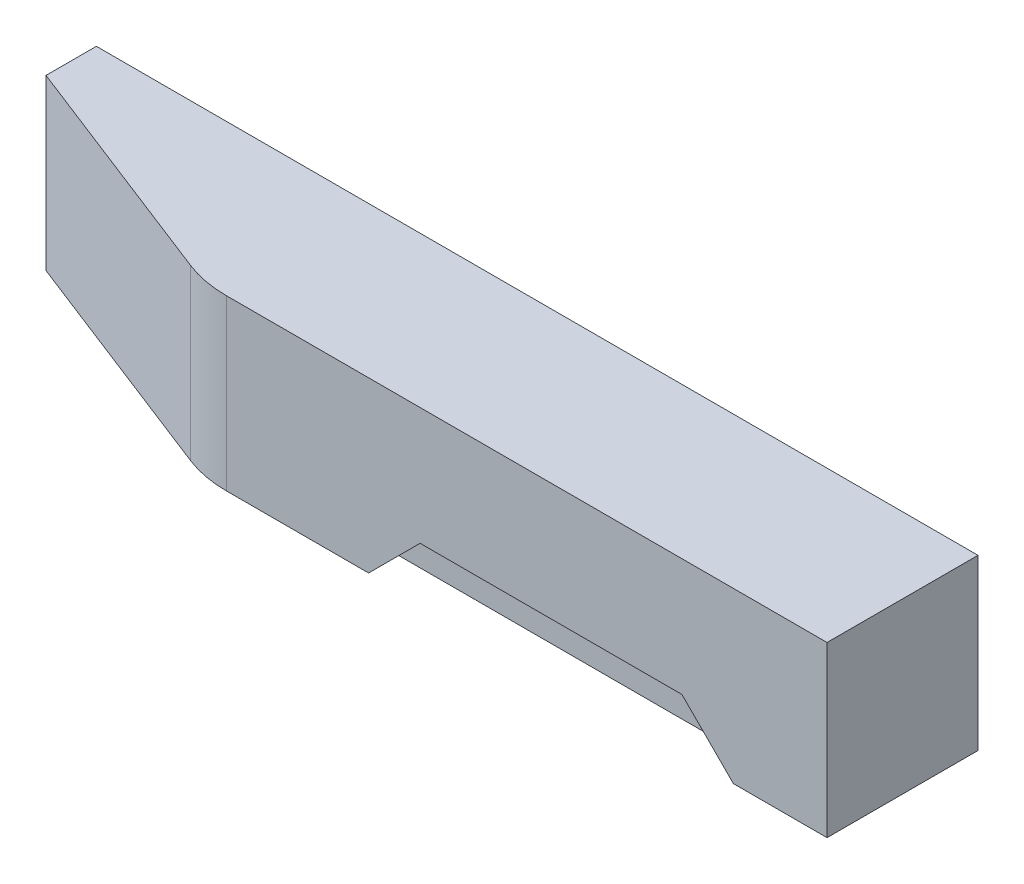
ISO-10303-21;
HEADER;
FILE_DESCRIPTION(('STEP AP214'),'2;1');
FILE_NAME('part.step','',(''),(''),'','','');
FILE_SCHEMA(('AUTOMOTIVE_DESIGN { 1 0 10303 214 1 1 1 1 }'));
ENDSEC;
DATA;
#1=APPLICATION_CONTEXT('core data for automotive mechanical design processes');
#2=APPLICATION_PROTOCOL_DEFINITION('international standard','automotive_design',2000,#1);
#3=PRODUCT_CONTEXT('',#1,'mechanical');
#4=PRODUCT('Part','Part','',(#3));
#5=PRODUCT_RELATED_PRODUCT_CATEGORY('part','',(#4));
#6=PRODUCT_DEFINITION_FORMATION('','',#4);
#7=PRODUCT_DEFINITION_CONTEXT('part definition',#1,'design');
#8=PRODUCT_DEFINITION('design','',#6,#7);
#9=PRODUCT_DEFINITION_SHAPE('','',#8);
#10=(LENGTH_UNIT() NAMED_UNIT(*) SI_UNIT(.MILLI.,.METRE.));
#11=(NAMED_UNIT(*) PLANE_ANGLE_UNIT() SI_UNIT($,.RADIAN.));
#12=(NAMED_UNIT(*) SI_UNIT($,.STERADIAN.) SOLID_ANGLE_UNIT());
#13=UNCERTAINTY_MEASURE_WITH_UNIT(LENGTH_MEASURE(1.E-05),#10,'distance_accuracy_value','');
#14=(GEOMETRIC_REPRESENTATION_CONTEXT(3) GLOBAL_UNCERTAINTY_ASSIGNED_CONTEXT((#13)) GLOBAL_UNIT_ASSIGNED_CONTEXT((#10,
#11,#12)) REPRESENTATION_CONTEXT('',''));
#15=CARTESIAN_POINT('',(0.,0.,0.));
#16=DIRECTION('',(0.,0.,1.));
#17=DIRECTION('',(1.,0.,0.));
#18=AXIS2_PLACEMENT_3D('',#15,#16,#17);
#19=CARTESIAN_POINT('',(-47.836398483139,24.6414389944274,179.620163865149));
#20=DIRECTION('',(0.,-1.,0.));
#21=DIRECTION('',(0.,0.,-1.));
#22=AXIS2_PLACEMENT_3D('',#19,#20,#21);
#23=PLANE('',#22);
#24=DIRECTION('',(0.9317989455985,0.,0.3629748269254));
#25=VECTOR('',#24,1.);
#26=CARTESIAN_POINT('',(-49.196580159362,24.6414389944274,183.111909732108));
#27=LINE('',#26,#25);
#28=CARTESIAN_POINT('',(-62.436398483139,24.6414389944274,177.95444439337));
#29=VERTEX_POINT('',#28);
#30=CARTESIAN_POINT('',(-58.510461474292,24.6414389944274,179.483761756346));
#31=VERTEX_POINT('',#30);
#32=EDGE_CURVE('E145',#29,#31,#27,.T.);
#33=ORIENTED_EDGE('',*,*,#32,.T.);
#34=CARTESIAN_POINT('',(-57.7845118204412,24.6414389944274,177.620163865149));
#35=DIRECTION('',(0.,-1.,0.));
#36=DIRECTION('',(0.,0.,-1.));
#37=AXIS2_PLACEMENT_3D('',#34,#35,#36);
#38=CIRCLE('',#37,2.);
#39=CARTESIAN_POINT('',(-57.7845118204412,24.6414389944274,179.620163865149));
#40=VERTEX_POINT('',#39);
#41=EDGE_CURVE('E177',#31,#40,#38,.F.);
#42=ORIENTED_EDGE('',*,*,#41,.T.);
#43=DIRECTION('',(-1.,0.,0.));
#44=VECTOR('',#43,1.);
#45=CARTESIAN_POINT('',(-47.836398483139,24.6414389944274,179.620163865149));
#46=LINE('',#45,#44);
#47=CARTESIAN_POINT('',(-47.836398483139,24.6414389944274,179.620163865149));
#48=VERTEX_POINT('',#47);
#49=EDGE_CURVE('E149',#48,#40,#46,.T.);
#50=ORIENTED_EDGE('',*,*,#49,.F.);
#51=DIRECTION('',(0.,0.,-1.));
#52=VECTOR('',#51,1.);
#53=CARTESIAN_POINT('',(-47.836398483139,24.6414389944274,179.620163865149));
#54=LINE('',#53,#52);
#55=CARTESIAN_POINT('',(-47.836398483139,24.6414389944274,177.120163865149));
#56=VERTEX_POINT('',#55);
#57=EDGE_CURVE('E156',#48,#56,#54,.T.);
#58=ORIENTED_EDGE('',*,*,#57,.T.);
#59=DIRECTION('',(-1.,0.,0.));
#60=VECTOR('',#59,1.);
#61=CARTESIAN_POINT('',(-47.836398483139,24.6414389944274,177.120163865149));
#62=LINE('',#61,#60);
#63=CARTESIAN_POINT('',(-62.436398483139,24.6414389944274,177.120163865149));
#64=VERTEX_POINT('',#63);
#65=EDGE_CURVE('E148',#56,#64,#62,.T.);
#66=ORIENTED_EDGE('',*,*,#65,.T.);
#67=DIRECTION('',(0.,0.,-1.));
#68=VECTOR('',#67,1.);
#69=CARTESIAN_POINT('',(-62.436398483139,24.6414389944274,179.620163865149));
#70=LINE('',#69,#68);
#71=EDGE_CURVE('E172',#29,#64,#70,.T.);
#72=ORIENTED_EDGE('',*,*,#71,.F.);
#73=EDGE_LOOP('',(#33,#42,#50,#58,#66,#72));
#74=FACE_BOUND('',#73,.T.);
#75=ADVANCED_FACE('F34',(#74),#23,.F.);
#76=CARTESIAN_POINT('',(-62.436398483139,24.6414389944274,179.620163865149));
#77=DIRECTION('',(1.,0.,0.));
#78=DIRECTION('',(0.,0.,-1.));
#79=AXIS2_PLACEMENT_3D('',#76,#77,#78);
#80=PLANE('',#79);
#81=DIRECTION('',(0.,0.,-1.));
#82=VECTOR('',#81,1.);
#83=CARTESIAN_POINT('',(-62.436398483139,21.8414389944274,179.620163865149));
#84=LINE('',#83,#82);
#85=CARTESIAN_POINT('',(-62.436398483139,21.8414389944274,177.95444439337));
#86=VERTEX_POINT('',#85);
#87=CARTESIAN_POINT('',(-62.436398483139,21.8414389944274,177.120163865149));
#88=VERTEX_POINT('',#87);
#89=EDGE_CURVE('E170',#86,#88,#84,.T.);
#90=ORIENTED_EDGE('',*,*,#89,.F.);
#91=DIRECTION('',(0.,-1.,0.));
#92=VECTOR('',#91,1.);
#93=CARTESIAN_POINT('',(-62.436398483139,25.3414389944274,177.95444439337));
#94=LINE('',#93,#92);
#95=EDGE_CURVE('E142',#29,#86,#94,.T.);
#96=ORIENTED_EDGE('',*,*,#95,.F.);
#97=ORIENTED_EDGE('',*,*,#71,.T.);
#98=DIRECTION('',(0.,-1.,0.));
#99=VECTOR('',#98,1.);
#100=CARTESIAN_POINT('',(-62.436398483139,24.6414389944274,177.120163865149));
#101=LINE('',#100,#99);
#102=EDGE_CURVE('E159',#64,#88,#101,.T.);
#103=ORIENTED_EDGE('',*,*,#102,.T.);
#104=EDGE_LOOP('',(#90,#96,#97,#103));
#105=FACE_BOUND('',#104,.T.);
#106=ADVANCED_FACE('F194',(#105),#80,.F.);
#107=CARTESIAN_POINT('',(-62.436398483139,21.8414389944274,179.620163865149));
#108=DIRECTION('',(0.,1.,0.));
#109=DIRECTION('',(0.,0.,1.));
#110=AXIS2_PLACEMENT_3D('',#107,#108,#109);
#111=PLANE('',#110);
#112=DIRECTION('',(1.,0.,0.));
#113=VECTOR('',#112,1.);
#114=CARTESIAN_POINT('',(-49.3870873860383,21.8414389944274,179.120163865149));
#115=LINE('',#114,#113);
#116=CARTESIAN_POINT('',(-55.4283586853574,21.8414389944274,179.120163865149));
#117=VERTEX_POINT('',#116);
#118=CARTESIAN_POINT('',(-49.3870873860383,21.8414389944274,179.120163865149));
#119=VERTEX_POINT('',#118);
#120=EDGE_CURVE('E118',#117,#119,#115,.T.);
#121=ORIENTED_EDGE('',*,*,#120,.F.);
#122=DIRECTION('',(0.,0.,1.));
#123=VECTOR('',#122,1.);
#124=CARTESIAN_POINT('',(-55.4283586853574,21.8414389944274,179.120163865149));
#125=LINE('',#124,#123);
#126=CARTESIAN_POINT('',(-55.4283586853574,21.8414389944274,179.620163865149));
#127=VERTEX_POINT('',#126);
#128=EDGE_CURVE('E143',#117,#127,#125,.T.);
#129=ORIENTED_EDGE('',*,*,#128,.T.);
#130=DIRECTION('',(1.,0.,0.));
#131=VECTOR('',#130,1.);
#132=CARTESIAN_POINT('',(-62.436398483139,21.8414389944274,179.620163865149));
#133=LINE('',#132,#131);
#134=CARTESIAN_POINT('',(-57.7845118204412,21.8414389944274,179.620163865149));
#135=VERTEX_POINT('',#134);
#136=EDGE_CURVE('E152',#135,#127,#133,.T.);
#137=ORIENTED_EDGE('',*,*,#136,.F.);
#138=CARTESIAN_POINT('',(-57.7845118204412,21.8414389944274,177.620163865149));
#139=DIRECTION('',(0.,1.,0.));
#140=DIRECTION('',(0.,0.,1.));
#141=AXIS2_PLACEMENT_3D('',#138,#139,#140);
#142=CIRCLE('',#141,2.);
#143=CARTESIAN_POINT('',(-58.510461474292,21.8414389944274,179.483761756346));
#144=VERTEX_POINT('',#143);
#145=EDGE_CURVE('E11',#135,#144,#142,.F.);
#146=ORIENTED_EDGE('',*,*,#145,.T.);
#147=DIRECTION('',(0.9317989455985,0.,0.3629748269254));
#148=VECTOR('',#147,1.);
#149=CARTESIAN_POINT('',(-62.436398483139,21.8414389944274,177.95444439337));
#150=LINE('',#149,#148);
#151=EDGE_CURVE('E139',#86,#144,#150,.T.);
#152=ORIENTED_EDGE('',*,*,#151,.F.);
#153=ORIENTED_EDGE('',*,*,#89,.T.);
#154=DIRECTION('',(1.,0.,0.));
#155=VECTOR('',#154,1.);
#156=CARTESIAN_POINT('',(-62.436398483139,21.8414389944274,177.120163865149));
#157=LINE('',#156,#155);
#158=CARTESIAN_POINT('',(-47.836398483139,21.8414389944274,177.120163865149));
#159=VERTEX_POINT('',#158);
#160=EDGE_CURVE('E162',#88,#159,#157,.T.);
#161=ORIENTED_EDGE('',*,*,#160,.T.);
#162=DIRECTION('',(0.,0.,-1.));
#163=VECTOR('',#162,1.);
#164=CARTESIAN_POINT('',(-47.836398483139,21.8414389944274,179.620163865149));
#165=LINE('',#164,#163);
#166=CARTESIAN_POINT('',(-47.836398483139,21.8414389944274,179.620163865149));
#167=VERTEX_POINT('',#166);
#168=EDGE_CURVE('E167',#167,#159,#165,.T.);
#169=ORIENTED_EDGE('',*,*,#168,.F.);
#170=CARTESIAN_POINT('',(-49.3870873860384,21.8414389944274,179.620163865149));
#171=VERTEX_POINT('',#170);
#172=EDGE_CURVE('E132',#171,#167,#133,.T.);
#173=ORIENTED_EDGE('',*,*,#172,.F.);
#174=DIRECTION('',(0.,0.,1.));
#175=VECTOR('',#174,1.);
#176=CARTESIAN_POINT('',(-49.3870873860383,21.8414389944274,179.120163865149));
#177=LINE('',#176,#175);
#178=EDGE_CURVE('E49',#119,#171,#177,.T.);
#179=ORIENTED_EDGE('',*,*,#178,.F.);
#180=EDGE_LOOP('',(#121,#129,#137,#146,#152,#153,#161,#169,#173,#179));
#181=FACE_BOUND('',#180,.T.);
#182=ADVANCED_FACE('F130',(#181),#111,.F.);
#183=CARTESIAN_POINT('',(-47.836398483139,21.8414389944274,179.620163865149));
#184=DIRECTION('',(-1.,0.,0.));
#185=DIRECTION('',(0.,0.,1.));
#186=AXIS2_PLACEMENT_3D('',#183,#184,#185);
#187=PLANE('',#186);
#188=DIRECTION('',(0.,1.,0.));
#189=VECTOR('',#188,1.);
#190=CARTESIAN_POINT('',(-47.836398483139,21.8414389944274,177.120163865149));
#191=LINE('',#190,#189);
#192=EDGE_CURVE('E151',#159,#56,#191,.T.);
#193=ORIENTED_EDGE('',*,*,#192,.T.);
#194=ORIENTED_EDGE('',*,*,#57,.F.);
#195=DIRECTION('',(0.,1.,0.));
#196=VECTOR('',#195,1.);
#197=CARTESIAN_POINT('',(-47.836398483139,21.8414389944274,179.620163865149));
#198=LINE('',#197,#196);
#199=EDGE_CURVE('E154',#167,#48,#198,.T.);
#200=ORIENTED_EDGE('',*,*,#199,.F.);
#201=ORIENTED_EDGE('',*,*,#168,.T.);
#202=EDGE_LOOP('',(#193,#194,#200,#201));
#203=FACE_BOUND('',#202,.T.);
#204=ADVANCED_FACE('F202',(#203),#187,.F.);
#205=CARTESIAN_POINT('',(0.,0.,179.620163865149));
#206=DIRECTION('',(0.,0.,1.));
#207=DIRECTION('',(1.,0.,0.));
#208=AXIS2_PLACEMENT_3D('',#205,#206,#207);
#209=PLANE('',#208);
#210=DIRECTION('',(-0.707106781186546,-0.707106781186549,0.));
#211=VECTOR('',#210,1.);
#212=CARTESIAN_POINT('',(-55.4283586853574,21.8414389944274,179.620163865149));
#213=LINE('',#212,#211);
#214=CARTESIAN_POINT('',(-54.5756385717614,22.6941591080234,179.620163865149));
#215=VERTEX_POINT('',#214);
#216=EDGE_CURVE('E127',#215,#127,#213,.T.);
#217=ORIENTED_EDGE('',*,*,#216,.F.);
#218=DIRECTION('',(-1.,0.,0.));
#219=VECTOR('',#218,1.);
#220=CARTESIAN_POINT('',(-54.5756385717614,22.6941591080234,179.620163865149));
#221=LINE('',#220,#219);
#222=CARTESIAN_POINT('',(-50.2398074996343,22.6941591080234,179.620163865149));
#223=VERTEX_POINT('',#222);
#224=EDGE_CURVE('E298',#223,#215,#221,.T.);
#225=ORIENTED_EDGE('',*,*,#224,.F.);
#226=DIRECTION('',(-0.707106781186549,0.707106781186546,0.));
#227=VECTOR('',#226,1.);
#228=CARTESIAN_POINT('',(-50.2398074996343,22.6941591080234,179.620163865149));
#229=LINE('',#228,#227);
#230=EDGE_CURVE('E299',#171,#223,#229,.T.);
#231=ORIENTED_EDGE('',*,*,#230,.F.);
#232=ORIENTED_EDGE('',*,*,#172,.T.);
#233=ORIENTED_EDGE('',*,*,#199,.T.);
#234=ORIENTED_EDGE('',*,*,#49,.T.);
#235=DIRECTION('',(0.,1.,0.));
#236=VECTOR('',#235,1.);
#237=CARTESIAN_POINT('',(-57.7845118204412,21.8414389944274,179.620163865149));
#238=LINE('',#237,#236);
#239=EDGE_CURVE('E42',#40,#135,#238,.F.);
#240=ORIENTED_EDGE('',*,*,#239,.T.);
#241=ORIENTED_EDGE('',*,*,#136,.T.);
#242=EDGE_LOOP('',(#217,#225,#231,#232,#233,#234,#240,#241));
#243=FACE_BOUND('',#242,.T.);
#244=ADVANCED_FACE('F184',(#243),#209,.T.);
#245=CARTESIAN_POINT('',(0.,0.,177.120163865149));
#246=DIRECTION('',(0.,0.,1.));
#247=DIRECTION('',(1.,0.,0.));
#248=AXIS2_PLACEMENT_3D('',#245,#246,#247);
#249=PLANE('',#248);
#250=ORIENTED_EDGE('',*,*,#65,.F.);
#251=ORIENTED_EDGE('',*,*,#192,.F.);
#252=ORIENTED_EDGE('',*,*,#160,.F.);
#253=ORIENTED_EDGE('',*,*,#102,.F.);
#254=EDGE_LOOP('',(#250,#251,#252,#253));
#255=FACE_BOUND('',#254,.T.);
#256=ADVANCED_FACE('F199',(#255),#249,.F.);
#257=CARTESIAN_POINT('',(-62.436398483139,25.3414389944274,177.95444439337));
#258=DIRECTION('',(0.3629748269254,0.,-0.9317989455985));
#259=DIRECTION('',(-0.9317989455985,0.,-0.3629748269254));
#260=AXIS2_PLACEMENT_3D('',#257,#258,#259);
#261=PLANE('',#260);
#262=ORIENTED_EDGE('',*,*,#151,.T.);
#263=DIRECTION('',(0.,1.,0.));
#264=VECTOR('',#263,1.);
#265=CARTESIAN_POINT('',(-58.510461474292,24.6414389944274,179.483761756346));
#266=LINE('',#265,#264);
#267=EDGE_CURVE('E174',#144,#31,#266,.T.);
#268=ORIENTED_EDGE('',*,*,#267,.T.);
#269=ORIENTED_EDGE('',*,*,#32,.F.);
#270=ORIENTED_EDGE('',*,*,#95,.T.);
#271=EDGE_LOOP('',(#262,#268,#269,#270));
#272=FACE_BOUND('',#271,.T.);
#273=ADVANCED_FACE('F191',(#272),#261,.F.);
#274=CARTESIAN_POINT('',(-57.7845118204412,25.3414389944274,177.620163865149));
#275=DIRECTION('',(0.,-1.,0.));
#276=DIRECTION('',(0.,0.,-1.));
#277=AXIS2_PLACEMENT_3D('',#274,#275,#276);
#278=CYLINDRICAL_SURFACE('',#277,2.);
#279=ORIENTED_EDGE('',*,*,#145,.F.);
#280=ORIENTED_EDGE('',*,*,#239,.F.);
#281=ORIENTED_EDGE('',*,*,#41,.F.);
#282=ORIENTED_EDGE('',*,*,#267,.F.);
#283=EDGE_LOOP('',(#279,#280,#281,#282));
#284=FACE_BOUND('',#283,.T.);
#285=ADVANCED_FACE('F36',(#284),#278,.T.);
#286=CARTESIAN_POINT('',(-55.4283586853574,21.8414389944274,179.120163865149));
#287=DIRECTION('',(-0.707106781186549,0.707106781186546,0.));
#288=DIRECTION('',(-0.707106781186546,-0.707106781186549,0.));
#289=AXIS2_PLACEMENT_3D('',#286,#287,#288);
#290=PLANE('',#289);
#291=ORIENTED_EDGE('',*,*,#216,.T.);
#292=ORIENTED_EDGE('',*,*,#128,.F.);
#293=DIRECTION('',(-0.707106781186546,-0.707106781186549,0.));
#294=VECTOR('',#293,1.);
#295=CARTESIAN_POINT('',(-55.4283586853574,21.8414389944274,179.120163865149));
#296=LINE('',#295,#294);
#297=CARTESIAN_POINT('',(-54.5756385717614,22.6941591080234,179.120163865149));
#298=VERTEX_POINT('',#297);
#299=EDGE_CURVE('E124',#298,#117,#296,.T.);
#300=ORIENTED_EDGE('',*,*,#299,.F.);
#301=DIRECTION('',(0.,0.,1.));
#302=VECTOR('',#301,1.);
#303=CARTESIAN_POINT('',(-54.5756385717614,22.6941591080234,179.120163865149));
#304=LINE('',#303,#302);
#305=EDGE_CURVE('E134',#298,#215,#304,.T.);
#306=ORIENTED_EDGE('',*,*,#305,.T.);
#307=EDGE_LOOP('',(#291,#292,#300,#306));
#308=FACE_BOUND('',#307,.T.);
#309=ADVANCED_FACE('F255',(#308),#290,.F.);
#310=CARTESIAN_POINT('',(-54.5756385717614,22.6941591080234,179.120163865149));
#311=DIRECTION('',(0.,1.,0.));
#312=DIRECTION('',(0.,0.,1.));
#313=AXIS2_PLACEMENT_3D('',#310,#311,#312);
#314=PLANE('',#313);
#315=ORIENTED_EDGE('',*,*,#224,.T.);
#316=ORIENTED_EDGE('',*,*,#305,.F.);
#317=DIRECTION('',(-1.,0.,0.));
#318=VECTOR('',#317,1.);
#319=CARTESIAN_POINT('',(-54.5756385717614,22.6941591080234,179.120163865149));
#320=LINE('',#319,#318);
#321=CARTESIAN_POINT('',(-50.2398074996343,22.6941591080234,179.120163865149));
#322=VERTEX_POINT('',#321);
#323=EDGE_CURVE('E117',#322,#298,#320,.T.);
#324=ORIENTED_EDGE('',*,*,#323,.F.);
#325=DIRECTION('',(0.,0.,1.));
#326=VECTOR('',#325,1.);
#327=CARTESIAN_POINT('',(-50.2398074996343,22.6941591080234,179.120163865149));
#328=LINE('',#327,#326);
#329=EDGE_CURVE('E113',#322,#223,#328,.T.);
#330=ORIENTED_EDGE('',*,*,#329,.T.);
#331=EDGE_LOOP('',(#315,#316,#324,#330));
#332=FACE_BOUND('',#331,.T.);
#333=ADVANCED_FACE('F262',(#332),#314,.F.);
#334=CARTESIAN_POINT('',(-50.2398074996343,22.6941591080234,179.120163865149));
#335=DIRECTION('',(0.707106781186546,0.707106781186549,0.));
#336=DIRECTION('',(-0.707106781186549,0.707106781186546,0.));
#337=AXIS2_PLACEMENT_3D('',#334,#335,#336);
#338=PLANE('',#337);
#339=ORIENTED_EDGE('',*,*,#230,.T.);
#340=ORIENTED_EDGE('',*,*,#329,.F.);
#341=DIRECTION('',(-0.707106781186549,0.707106781186546,0.));
#342=VECTOR('',#341,1.);
#343=CARTESIAN_POINT('',(-50.2398074996343,22.6941591080234,179.120163865149));
#344=LINE('',#343,#342);
#345=EDGE_CURVE('E110',#119,#322,#344,.T.);
#346=ORIENTED_EDGE('',*,*,#345,.F.);
#347=ORIENTED_EDGE('',*,*,#178,.T.);
#348=EDGE_LOOP('',(#339,#340,#346,#347));
#349=FACE_BOUND('',#348,.T.);
#350=ADVANCED_FACE('F112',(#349),#338,.F.);
#351=CARTESIAN_POINT('',(0.,0.,179.120163865149));
#352=DIRECTION('',(0.,0.,-1.));
#353=DIRECTION('',(-1.,0.,0.));
#354=AXIS2_PLACEMENT_3D('',#351,#352,#353);
#355=PLANE('',#354);
#356=ORIENTED_EDGE('',*,*,#120,.T.);
#357=ORIENTED_EDGE('',*,*,#345,.T.);
#358=ORIENTED_EDGE('',*,*,#323,.T.);
#359=ORIENTED_EDGE('',*,*,#299,.T.);
#360=EDGE_LOOP('',(#356,#357,#358,#359));
#361=FACE_BOUND('',#360,.T.);
#362=ADVANCED_FACE('F122',(#361),#355,.F.);
#363=CLOSED_SHELL('',(#75,#106,#182,#204,#244,#256,#273,#285,#309,#333,#350,#362));
#364=MANIFOLD_SOLID_BREP('B2',#363);
#365=ADVANCED_BREP_SHAPE_REPRESENTATION('',(#18,#364),#14);
#366=SHAPE_DEFINITION_REPRESENTATION(#9,#365);
ENDSEC;
END-ISO-10303-21;
